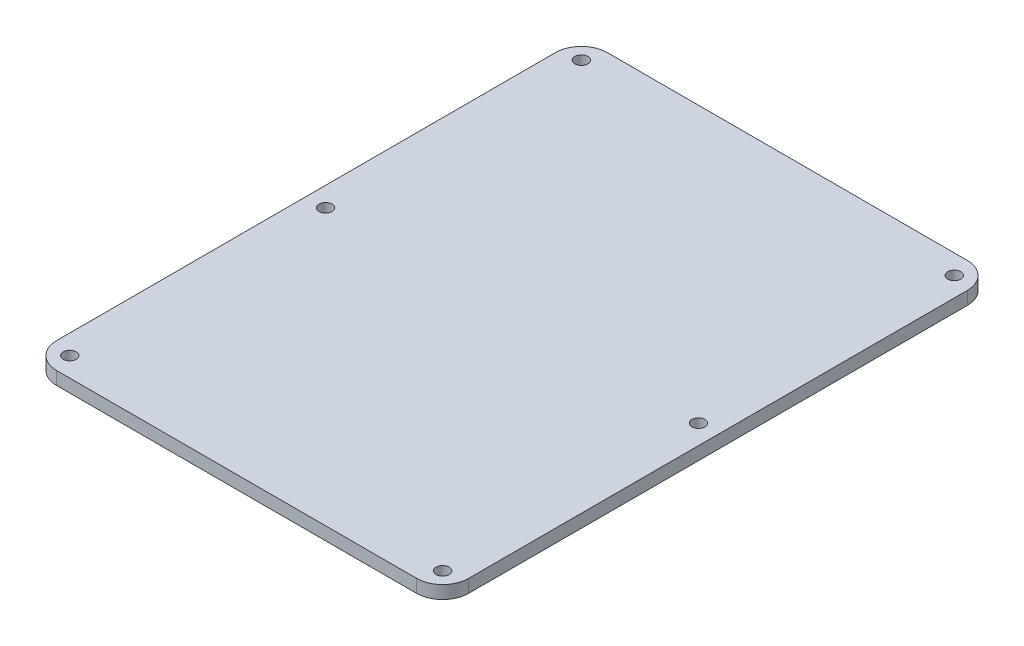
ISO-10303-21;
HEADER;
FILE_DESCRIPTION(('STEP AP214'),'2;1');
FILE_NAME('part.step','',(''),(''),'','','');
FILE_SCHEMA(('AUTOMOTIVE_DESIGN { 1 0 10303 214 1 1 1 1 }'));
ENDSEC;
DATA;
#1=APPLICATION_CONTEXT('core data for automotive mechanical design processes');
#2=APPLICATION_PROTOCOL_DEFINITION('international standard','automotive_design',2000,#1);
#3=PRODUCT_CONTEXT('',#1,'mechanical');
#4=PRODUCT('Part','Part','',(#3));
#5=PRODUCT_RELATED_PRODUCT_CATEGORY('part','',(#4));
#6=PRODUCT_DEFINITION_FORMATION('','',#4);
#7=PRODUCT_DEFINITION_CONTEXT('part definition',#1,'design');
#8=PRODUCT_DEFINITION('design','',#6,#7);
#9=PRODUCT_DEFINITION_SHAPE('','',#8);
#10=(LENGTH_UNIT() NAMED_UNIT(*) SI_UNIT(.MILLI.,.METRE.));
#11=(NAMED_UNIT(*) PLANE_ANGLE_UNIT() SI_UNIT($,.RADIAN.));
#12=(NAMED_UNIT(*) SI_UNIT($,.STERADIAN.) SOLID_ANGLE_UNIT());
#13=UNCERTAINTY_MEASURE_WITH_UNIT(LENGTH_MEASURE(1.E-05),#10,'distance_accuracy_value','');
#14=(GEOMETRIC_REPRESENTATION_CONTEXT(3) GLOBAL_UNCERTAINTY_ASSIGNED_CONTEXT((#13)) GLOBAL_UNIT_ASSIGNED_CONTEXT((#10,
#11,#12)) REPRESENTATION_CONTEXT('',''));
#15=CARTESIAN_POINT('',(0.,0.,0.));
#16=DIRECTION('',(0.,0.,1.));
#17=DIRECTION('',(1.,0.,0.));
#18=AXIS2_PLACEMENT_3D('',#15,#16,#17);
#19=CARTESIAN_POINT('',(47.5,3.,63.5));
#20=DIRECTION('',(-1.,0.,0.));
#21=DIRECTION('',(0.,0.,1.));
#22=AXIS2_PLACEMENT_3D('',#19,#20,#21);
#23=PLANE('',#22);
#24=DIRECTION('',(0.,0.,-1.));
#25=VECTOR('',#24,1.);
#26=CARTESIAN_POINT('',(47.5,0.,63.5));
#27=LINE('',#26,#25);
#28=CARTESIAN_POINT('',(47.5,0.,57.5));
#29=VERTEX_POINT('',#28);
#30=CARTESIAN_POINT('',(47.5,0.,-57.5));
#31=VERTEX_POINT('',#30);
#32=EDGE_CURVE('E126',#29,#31,#27,.T.);
#33=ORIENTED_EDGE('',*,*,#32,.T.);
#34=DIRECTION('',(0.,-1.,0.));
#35=VECTOR('',#34,1.);
#36=CARTESIAN_POINT('',(47.5,3.,-57.5));
#37=LINE('',#36,#35);
#38=CARTESIAN_POINT('',(47.5,3.,-57.5));
#39=VERTEX_POINT('',#38);
#40=EDGE_CURVE('E104',#31,#39,#37,.F.);
#41=ORIENTED_EDGE('',*,*,#40,.T.);
#42=DIRECTION('',(0.,0.,-1.));
#43=VECTOR('',#42,1.);
#44=CARTESIAN_POINT('',(47.5,3.,63.5));
#45=LINE('',#44,#43);
#46=CARTESIAN_POINT('',(47.5,3.,57.5));
#47=VERTEX_POINT('',#46);
#48=EDGE_CURVE('E136',#47,#39,#45,.T.);
#49=ORIENTED_EDGE('',*,*,#48,.F.);
#50=DIRECTION('',(0.,-1.,0.));
#51=VECTOR('',#50,1.);
#52=CARTESIAN_POINT('',(47.5,3.,57.5));
#53=LINE('',#52,#51);
#54=EDGE_CURVE('E109',#47,#29,#53,.T.);
#55=ORIENTED_EDGE('',*,*,#54,.T.);
#56=EDGE_LOOP('',(#33,#41,#49,#55));
#57=FACE_BOUND('',#56,.T.);
#58=ADVANCED_FACE('F33',(#57),#23,.F.);
#59=CARTESIAN_POINT('',(-47.5,3.,-63.5));
#60=DIRECTION('',(0.,0.,1.));
#61=DIRECTION('',(1.,0.,0.));
#62=AXIS2_PLACEMENT_3D('',#59,#60,#61);
#63=PLANE('',#62);
#64=DIRECTION('',(-1.,0.,0.));
#65=VECTOR('',#64,1.);
#66=CARTESIAN_POINT('',(-47.5,3.,-63.5));
#67=LINE('',#66,#65);
#68=CARTESIAN_POINT('',(41.5,3.,-63.5));
#69=VERTEX_POINT('',#68);
#70=CARTESIAN_POINT('',(-41.5,3.,-63.5));
#71=VERTEX_POINT('',#70);
#72=EDGE_CURVE('E119',#69,#71,#67,.T.);
#73=ORIENTED_EDGE('',*,*,#72,.F.);
#74=DIRECTION('',(0.,-1.,0.));
#75=VECTOR('',#74,1.);
#76=CARTESIAN_POINT('',(41.5,3.,-63.5));
#77=LINE('',#76,#75);
#78=CARTESIAN_POINT('',(41.5,0.,-63.5));
#79=VERTEX_POINT('',#78);
#80=EDGE_CURVE('E103',#69,#79,#77,.T.);
#81=ORIENTED_EDGE('',*,*,#80,.T.);
#82=DIRECTION('',(-1.,0.,0.));
#83=VECTOR('',#82,1.);
#84=CARTESIAN_POINT('',(-47.5,0.,-63.5));
#85=LINE('',#84,#83);
#86=CARTESIAN_POINT('',(-41.5,0.,-63.5));
#87=VERTEX_POINT('',#86);
#88=EDGE_CURVE('E116',#79,#87,#85,.T.);
#89=ORIENTED_EDGE('',*,*,#88,.T.);
#90=DIRECTION('',(0.,-1.,0.));
#91=VECTOR('',#90,1.);
#92=CARTESIAN_POINT('',(-41.5,3.,-63.5));
#93=LINE('',#92,#91);
#94=EDGE_CURVE('E121',#87,#71,#93,.F.);
#95=ORIENTED_EDGE('',*,*,#94,.T.);
#96=EDGE_LOOP('',(#73,#81,#89,#95));
#97=FACE_BOUND('',#96,.T.);
#98=ADVANCED_FACE('F115',(#97),#63,.F.);
#99=CARTESIAN_POINT('',(-47.5,3.,63.5));
#100=DIRECTION('',(1.,0.,0.));
#101=DIRECTION('',(0.,0.,-1.));
#102=AXIS2_PLACEMENT_3D('',#99,#100,#101);
#103=PLANE('',#102);
#104=DIRECTION('',(0.,0.,1.));
#105=VECTOR('',#104,1.);
#106=CARTESIAN_POINT('',(-47.5,3.,63.5));
#107=LINE('',#106,#105);
#108=CARTESIAN_POINT('',(-47.5,3.,-57.5));
#109=VERTEX_POINT('',#108);
#110=CARTESIAN_POINT('',(-47.5,3.,57.5));
#111=VERTEX_POINT('',#110);
#112=EDGE_CURVE('E162',#109,#111,#107,.T.);
#113=ORIENTED_EDGE('',*,*,#112,.F.);
#114=DIRECTION('',(0.,-1.,0.));
#115=VECTOR('',#114,1.);
#116=CARTESIAN_POINT('',(-47.5,3.,-57.5));
#117=LINE('',#116,#115);
#118=CARTESIAN_POINT('',(-47.5,0.,-57.5));
#119=VERTEX_POINT('',#118);
#120=EDGE_CURVE('E155',#109,#119,#117,.T.);
#121=ORIENTED_EDGE('',*,*,#120,.T.);
#122=DIRECTION('',(0.,0.,1.));
#123=VECTOR('',#122,1.);
#124=CARTESIAN_POINT('',(-47.5,0.,63.5));
#125=LINE('',#124,#123);
#126=CARTESIAN_POINT('',(-47.5,0.,57.5));
#127=VERTEX_POINT('',#126);
#128=EDGE_CURVE('E125',#119,#127,#125,.T.);
#129=ORIENTED_EDGE('',*,*,#128,.T.);
#130=DIRECTION('',(0.,-1.,0.));
#131=VECTOR('',#130,1.);
#132=CARTESIAN_POINT('',(-47.5,3.,57.5));
#133=LINE('',#132,#131);
#134=EDGE_CURVE('E153',#127,#111,#133,.F.);
#135=ORIENTED_EDGE('',*,*,#134,.T.);
#136=EDGE_LOOP('',(#113,#121,#129,#135));
#137=FACE_BOUND('',#136,.T.);
#138=ADVANCED_FACE('F160',(#137),#103,.F.);
#139=CARTESIAN_POINT('',(-47.5,3.,63.5));
#140=DIRECTION('',(0.,0.,-1.));
#141=DIRECTION('',(-1.,0.,0.));
#142=AXIS2_PLACEMENT_3D('',#139,#140,#141);
#143=PLANE('',#142);
#144=DIRECTION('',(1.,0.,0.));
#145=VECTOR('',#144,1.);
#146=CARTESIAN_POINT('',(-47.5,3.,63.5));
#147=LINE('',#146,#145);
#148=CARTESIAN_POINT('',(-41.5,3.,63.5));
#149=VERTEX_POINT('',#148);
#150=CARTESIAN_POINT('',(41.5,3.,63.5));
#151=VERTEX_POINT('',#150);
#152=EDGE_CURVE('E137',#149,#151,#147,.T.);
#153=ORIENTED_EDGE('',*,*,#152,.F.);
#154=DIRECTION('',(0.,-1.,0.));
#155=VECTOR('',#154,1.);
#156=CARTESIAN_POINT('',(-41.5,3.,63.5));
#157=LINE('',#156,#155);
#158=CARTESIAN_POINT('',(-41.5,0.,63.5));
#159=VERTEX_POINT('',#158);
#160=EDGE_CURVE('E11',#149,#159,#157,.T.);
#161=ORIENTED_EDGE('',*,*,#160,.T.);
#162=DIRECTION('',(1.,0.,0.));
#163=VECTOR('',#162,1.);
#164=CARTESIAN_POINT('',(-47.5,0.,63.5));
#165=LINE('',#164,#163);
#166=CARTESIAN_POINT('',(41.5,0.,63.5));
#167=VERTEX_POINT('',#166);
#168=EDGE_CURVE('E129',#159,#167,#165,.T.);
#169=ORIENTED_EDGE('',*,*,#168,.T.);
#170=DIRECTION('',(0.,-1.,0.));
#171=VECTOR('',#170,1.);
#172=CARTESIAN_POINT('',(41.5,3.,63.5));
#173=LINE('',#172,#171);
#174=EDGE_CURVE('E41',#167,#151,#173,.F.);
#175=ORIENTED_EDGE('',*,*,#174,.T.);
#176=EDGE_LOOP('',(#153,#161,#169,#175));
#177=FACE_BOUND('',#176,.T.);
#178=ADVANCED_FACE('F169',(#177),#143,.F.);
#179=CARTESIAN_POINT('',(0.,3.,0.));
#180=DIRECTION('',(0.,-1.,0.));
#181=DIRECTION('',(0.,0.,-1.));
#182=AXIS2_PLACEMENT_3D('',#179,#180,#181);
#183=PLANE('',#182);
#184=CARTESIAN_POINT('',(43.,3.,0.));
#185=DIRECTION('',(0.,-1.,0.));
#186=DIRECTION('',(0.,0.,1.));
#187=AXIS2_PLACEMENT_3D('',#184,#185,#186);
#188=CIRCLE('',#187,1.5);
#189=CARTESIAN_POINT('',(43.,3.,1.5));
#190=VERTEX_POINT('',#189);
#191=EDGE_CURVE('E206',#190,#190,#188,.T.);
#192=ORIENTED_EDGE('',*,*,#191,.T.);
#193=EDGE_LOOP('',(#192));
#194=FACE_BOUND('',#193,.T.);
#195=CARTESIAN_POINT('',(43.,3.,59.));
#196=DIRECTION('',(0.,1.,0.));
#197=DIRECTION('',(0.,0.,-1.));
#198=AXIS2_PLACEMENT_3D('',#195,#196,#197);
#199=CIRCLE('',#198,1.5);
#200=CARTESIAN_POINT('',(43.,3.,57.5));
#201=VERTEX_POINT('',#200);
#202=EDGE_CURVE('E200',#201,#201,#199,.T.);
#203=ORIENTED_EDGE('',*,*,#202,.F.);
#204=EDGE_LOOP('',(#203));
#205=FACE_BOUND('',#204,.T.);
#206=CARTESIAN_POINT('',(43.,3.,-59.));
#207=DIRECTION('',(0.,-1.,0.));
#208=DIRECTION('',(0.,0.,1.));
#209=AXIS2_PLACEMENT_3D('',#206,#207,#208);
#210=CIRCLE('',#209,1.5);
#211=CARTESIAN_POINT('',(43.,3.,-57.5));
#212=VERTEX_POINT('',#211);
#213=EDGE_CURVE('E194',#212,#212,#210,.T.);
#214=ORIENTED_EDGE('',*,*,#213,.T.);
#215=EDGE_LOOP('',(#214));
#216=FACE_BOUND('',#215,.T.);
#217=CARTESIAN_POINT('',(-43.,3.,0.));
#218=DIRECTION('',(0.,1.,0.));
#219=DIRECTION('',(0.,0.,1.));
#220=AXIS2_PLACEMENT_3D('',#217,#218,#219);
#221=CIRCLE('',#220,1.5);
#222=CARTESIAN_POINT('',(-43.,3.,1.5));
#223=VERTEX_POINT('',#222);
#224=EDGE_CURVE('E188',#223,#223,#221,.T.);
#225=ORIENTED_EDGE('',*,*,#224,.F.);
#226=EDGE_LOOP('',(#225));
#227=FACE_BOUND('',#226,.T.);
#228=CARTESIAN_POINT('',(-43.,3.,59.));
#229=DIRECTION('',(0.,-1.,0.));
#230=DIRECTION('',(0.,0.,-1.));
#231=AXIS2_PLACEMENT_3D('',#228,#229,#230);
#232=CIRCLE('',#231,1.5);
#233=CARTESIAN_POINT('',(-43.,3.,57.5));
#234=VERTEX_POINT('',#233);
#235=EDGE_CURVE('E182',#234,#234,#232,.T.);
#236=ORIENTED_EDGE('',*,*,#235,.T.);
#237=EDGE_LOOP('',(#236));
#238=FACE_BOUND('',#237,.T.);
#239=CARTESIAN_POINT('',(-43.,3.,-59.));
#240=DIRECTION('',(0.,1.,0.));
#241=DIRECTION('',(0.,0.,1.));
#242=AXIS2_PLACEMENT_3D('',#239,#240,#241);
#243=CIRCLE('',#242,1.5);
#244=CARTESIAN_POINT('',(-43.,3.,-57.5));
#245=VERTEX_POINT('',#244);
#246=EDGE_CURVE('E176',#245,#245,#243,.T.);
#247=ORIENTED_EDGE('',*,*,#246,.F.);
#248=EDGE_LOOP('',(#247));
#249=FACE_BOUND('',#248,.T.);
#250=ORIENTED_EDGE('',*,*,#48,.T.);
#251=CARTESIAN_POINT('',(41.5,3.,-57.5));
#252=DIRECTION('',(0.,-1.,0.));
#253=DIRECTION('',(0.,0.,-1.));
#254=AXIS2_PLACEMENT_3D('',#251,#252,#253);
#255=CIRCLE('',#254,6.);
#256=EDGE_CURVE('E151',#39,#69,#255,.F.);
#257=ORIENTED_EDGE('',*,*,#256,.T.);
#258=ORIENTED_EDGE('',*,*,#72,.T.);
#259=CARTESIAN_POINT('',(-41.5,3.,-57.5));
#260=DIRECTION('',(0.,-1.,0.));
#261=DIRECTION('',(0.,0.,-1.));
#262=AXIS2_PLACEMENT_3D('',#259,#260,#261);
#263=CIRCLE('',#262,6.);
#264=EDGE_CURVE('E149',#71,#109,#263,.F.);
#265=ORIENTED_EDGE('',*,*,#264,.T.);
#266=ORIENTED_EDGE('',*,*,#112,.T.);
#267=CARTESIAN_POINT('',(-41.5,3.,57.5));
#268=DIRECTION('',(0.,-1.,0.));
#269=DIRECTION('',(0.,0.,-1.));
#270=AXIS2_PLACEMENT_3D('',#267,#268,#269);
#271=CIRCLE('',#270,6.);
#272=EDGE_CURVE('E54',#111,#149,#271,.F.);
#273=ORIENTED_EDGE('',*,*,#272,.T.);
#274=ORIENTED_EDGE('',*,*,#152,.T.);
#275=CARTESIAN_POINT('',(41.5,3.,57.5));
#276=DIRECTION('',(0.,-1.,0.));
#277=DIRECTION('',(0.,0.,-1.));
#278=AXIS2_PLACEMENT_3D('',#275,#276,#277);
#279=CIRCLE('',#278,6.);
#280=EDGE_CURVE('E146',#151,#47,#279,.F.);
#281=ORIENTED_EDGE('',*,*,#280,.T.);
#282=EDGE_LOOP('',(#250,#257,#258,#265,#266,#273,#274,#281));
#283=FACE_BOUND('',#282,.T.);
#284=ADVANCED_FACE('F217',(#194,#205,#216,#227,#238,#249,#283),#183,.F.);
#285=CARTESIAN_POINT('',(0.,0.,0.));
#286=DIRECTION('',(0.,-1.,0.));
#287=DIRECTION('',(0.,0.,-1.));
#288=AXIS2_PLACEMENT_3D('',#285,#286,#287);
#289=PLANE('',#288);
#290=CARTESIAN_POINT('',(43.,0.,0.));
#291=DIRECTION('',(0.,-1.,0.));
#292=DIRECTION('',(0.,0.,1.));
#293=AXIS2_PLACEMENT_3D('',#290,#291,#292);
#294=CIRCLE('',#293,1.5);
#295=CARTESIAN_POINT('',(43.,0.,1.5));
#296=VERTEX_POINT('',#295);
#297=EDGE_CURVE('E203',#296,#296,#294,.T.);
#298=ORIENTED_EDGE('',*,*,#297,.F.);
#299=EDGE_LOOP('',(#298));
#300=FACE_BOUND('',#299,.T.);
#301=CARTESIAN_POINT('',(43.,0.,59.));
#302=DIRECTION('',(0.,1.,0.));
#303=DIRECTION('',(0.,0.,-1.));
#304=AXIS2_PLACEMENT_3D('',#301,#302,#303);
#305=CIRCLE('',#304,1.5);
#306=CARTESIAN_POINT('',(43.,0.,57.5));
#307=VERTEX_POINT('',#306);
#308=EDGE_CURVE('E197',#307,#307,#305,.T.);
#309=ORIENTED_EDGE('',*,*,#308,.T.);
#310=EDGE_LOOP('',(#309));
#311=FACE_BOUND('',#310,.T.);
#312=CARTESIAN_POINT('',(43.,0.,-59.));
#313=DIRECTION('',(0.,-1.,0.));
#314=DIRECTION('',(0.,0.,1.));
#315=AXIS2_PLACEMENT_3D('',#312,#313,#314);
#316=CIRCLE('',#315,1.5);
#317=CARTESIAN_POINT('',(43.,0.,-57.5));
#318=VERTEX_POINT('',#317);
#319=EDGE_CURVE('E191',#318,#318,#316,.T.);
#320=ORIENTED_EDGE('',*,*,#319,.F.);
#321=EDGE_LOOP('',(#320));
#322=FACE_BOUND('',#321,.T.);
#323=CARTESIAN_POINT('',(-43.,0.,0.));
#324=DIRECTION('',(0.,1.,0.));
#325=DIRECTION('',(0.,0.,1.));
#326=AXIS2_PLACEMENT_3D('',#323,#324,#325);
#327=CIRCLE('',#326,1.5);
#328=CARTESIAN_POINT('',(-43.,0.,1.5));
#329=VERTEX_POINT('',#328);
#330=EDGE_CURVE('E185',#329,#329,#327,.T.);
#331=ORIENTED_EDGE('',*,*,#330,.T.);
#332=EDGE_LOOP('',(#331));
#333=FACE_BOUND('',#332,.T.);
#334=CARTESIAN_POINT('',(-43.,0.,59.));
#335=DIRECTION('',(0.,-1.,0.));
#336=DIRECTION('',(0.,0.,-1.));
#337=AXIS2_PLACEMENT_3D('',#334,#335,#336);
#338=CIRCLE('',#337,1.5);
#339=CARTESIAN_POINT('',(-43.,0.,57.5));
#340=VERTEX_POINT('',#339);
#341=EDGE_CURVE('E179',#340,#340,#338,.T.);
#342=ORIENTED_EDGE('',*,*,#341,.F.);
#343=EDGE_LOOP('',(#342));
#344=FACE_BOUND('',#343,.T.);
#345=CARTESIAN_POINT('',(-43.,0.,-59.));
#346=DIRECTION('',(0.,1.,0.));
#347=DIRECTION('',(0.,0.,1.));
#348=AXIS2_PLACEMENT_3D('',#345,#346,#347);
#349=CIRCLE('',#348,1.5);
#350=CARTESIAN_POINT('',(-43.,0.,-57.5));
#351=VERTEX_POINT('',#350);
#352=EDGE_CURVE('E131',#351,#351,#349,.T.);
#353=ORIENTED_EDGE('',*,*,#352,.T.);
#354=EDGE_LOOP('',(#353));
#355=FACE_BOUND('',#354,.T.);
#356=ORIENTED_EDGE('',*,*,#88,.F.);
#357=CARTESIAN_POINT('',(41.5,0.,-57.5));
#358=DIRECTION('',(0.,-1.,0.));
#359=DIRECTION('',(0.,0.,-1.));
#360=AXIS2_PLACEMENT_3D('',#357,#358,#359);
#361=CIRCLE('',#360,6.);
#362=EDGE_CURVE('E99',#79,#31,#361,.T.);
#363=ORIENTED_EDGE('',*,*,#362,.T.);
#364=ORIENTED_EDGE('',*,*,#32,.F.);
#365=CARTESIAN_POINT('',(41.5,0.,57.5));
#366=DIRECTION('',(0.,-1.,0.));
#367=DIRECTION('',(0.,0.,-1.));
#368=AXIS2_PLACEMENT_3D('',#365,#366,#367);
#369=CIRCLE('',#368,6.);
#370=EDGE_CURVE('E120',#29,#167,#369,.T.);
#371=ORIENTED_EDGE('',*,*,#370,.T.);
#372=ORIENTED_EDGE('',*,*,#168,.F.);
#373=CARTESIAN_POINT('',(-41.5,0.,57.5));
#374=DIRECTION('',(0.,-1.,0.));
#375=DIRECTION('',(0.,0.,-1.));
#376=AXIS2_PLACEMENT_3D('',#373,#374,#375);
#377=CIRCLE('',#376,6.);
#378=EDGE_CURVE('E140',#159,#127,#377,.T.);
#379=ORIENTED_EDGE('',*,*,#378,.T.);
#380=ORIENTED_EDGE('',*,*,#128,.F.);
#381=CARTESIAN_POINT('',(-41.5,0.,-57.5));
#382=DIRECTION('',(0.,-1.,0.));
#383=DIRECTION('',(0.,0.,-1.));
#384=AXIS2_PLACEMENT_3D('',#381,#382,#383);
#385=CIRCLE('',#384,6.);
#386=EDGE_CURVE('E110',#119,#87,#385,.T.);
#387=ORIENTED_EDGE('',*,*,#386,.T.);
#388=EDGE_LOOP('',(#356,#363,#364,#371,#372,#379,#380,#387));
#389=FACE_BOUND('',#388,.T.);
#390=ADVANCED_FACE('F123',(#300,#311,#322,#333,#344,#355,#389),#289,.T.);
#391=CARTESIAN_POINT('',(41.5,3.,-57.5));
#392=DIRECTION('',(0.,-1.,0.));
#393=DIRECTION('',(0.,0.,-1.));
#394=AXIS2_PLACEMENT_3D('',#391,#392,#393);
#395=CYLINDRICAL_SURFACE('',#394,6.);
#396=ORIENTED_EDGE('',*,*,#256,.F.);
#397=ORIENTED_EDGE('',*,*,#40,.F.);
#398=ORIENTED_EDGE('',*,*,#362,.F.);
#399=ORIENTED_EDGE('',*,*,#80,.F.);
#400=EDGE_LOOP('',(#396,#397,#398,#399));
#401=FACE_BOUND('',#400,.T.);
#402=ADVANCED_FACE('F102',(#401),#395,.T.);
#403=CARTESIAN_POINT('',(-41.5,3.,-57.5));
#404=DIRECTION('',(0.,-1.,0.));
#405=DIRECTION('',(0.,0.,-1.));
#406=AXIS2_PLACEMENT_3D('',#403,#404,#405);
#407=CYLINDRICAL_SURFACE('',#406,6.);
#408=ORIENTED_EDGE('',*,*,#264,.F.);
#409=ORIENTED_EDGE('',*,*,#94,.F.);
#410=ORIENTED_EDGE('',*,*,#386,.F.);
#411=ORIENTED_EDGE('',*,*,#120,.F.);
#412=EDGE_LOOP('',(#408,#409,#410,#411));
#413=FACE_BOUND('',#412,.T.);
#414=ADVANCED_FACE('F247',(#413),#407,.T.);
#415=CARTESIAN_POINT('',(-41.5,3.,57.5));
#416=DIRECTION('',(0.,-1.,0.));
#417=DIRECTION('',(0.,0.,-1.));
#418=AXIS2_PLACEMENT_3D('',#415,#416,#417);
#419=CYLINDRICAL_SURFACE('',#418,6.);
#420=ORIENTED_EDGE('',*,*,#272,.F.);
#421=ORIENTED_EDGE('',*,*,#134,.F.);
#422=ORIENTED_EDGE('',*,*,#378,.F.);
#423=ORIENTED_EDGE('',*,*,#160,.F.);
#424=EDGE_LOOP('',(#420,#421,#422,#423));
#425=FACE_BOUND('',#424,.T.);
#426=ADVANCED_FACE('F168',(#425),#419,.T.);
#427=CARTESIAN_POINT('',(41.5,3.,57.5));
#428=DIRECTION('',(0.,-1.,0.));
#429=DIRECTION('',(0.,0.,-1.));
#430=AXIS2_PLACEMENT_3D('',#427,#428,#429);
#431=CYLINDRICAL_SURFACE('',#430,6.);
#432=ORIENTED_EDGE('',*,*,#280,.F.);
#433=ORIENTED_EDGE('',*,*,#174,.F.);
#434=ORIENTED_EDGE('',*,*,#370,.F.);
#435=ORIENTED_EDGE('',*,*,#54,.F.);
#436=EDGE_LOOP('',(#432,#433,#434,#435));
#437=FACE_BOUND('',#436,.T.);
#438=ADVANCED_FACE('F35',(#437),#431,.T.);
#439=CARTESIAN_POINT('',(-43.,0.,-59.));
#440=DIRECTION('',(0.,1.,0.));
#441=DIRECTION('',(0.,0.,1.));
#442=AXIS2_PLACEMENT_3D('',#439,#440,#441);
#443=CYLINDRICAL_SURFACE('',#442,1.5);
#444=ORIENTED_EDGE('',*,*,#352,.F.);
#445=EDGE_LOOP('',(#444));
#446=FACE_BOUND('',#445,.T.);
#447=ORIENTED_EDGE('',*,*,#246,.T.);
#448=EDGE_LOOP('',(#447));
#449=FACE_BOUND('',#448,.T.);
#450=ADVANCED_FACE('F229',(#446,#449),#443,.F.);
#451=CARTESIAN_POINT('',(-43.,0.,59.));
#452=DIRECTION('',(0.,1.,0.));
#453=DIRECTION('',(0.,0.,1.));
#454=AXIS2_PLACEMENT_3D('',#451,#452,#453);
#455=CYLINDRICAL_SURFACE('',#454,1.5);
#456=ORIENTED_EDGE('',*,*,#341,.T.);
#457=EDGE_LOOP('',(#456));
#458=FACE_BOUND('',#457,.T.);
#459=ORIENTED_EDGE('',*,*,#235,.F.);
#460=EDGE_LOOP('',(#459));
#461=FACE_BOUND('',#460,.T.);
#462=ADVANCED_FACE('F232',(#458,#461),#455,.F.);
#463=CARTESIAN_POINT('',(-43.,0.,0.));
#464=DIRECTION('',(0.,1.,0.));
#465=DIRECTION('',(0.,0.,1.));
#466=AXIS2_PLACEMENT_3D('',#463,#464,#465);
#467=CYLINDRICAL_SURFACE('',#466,1.5);
#468=ORIENTED_EDGE('',*,*,#330,.F.);
#469=EDGE_LOOP('',(#468));
#470=FACE_BOUND('',#469,.T.);
#471=ORIENTED_EDGE('',*,*,#224,.T.);
#472=EDGE_LOOP('',(#471));
#473=FACE_BOUND('',#472,.T.);
#474=ADVANCED_FACE('F286',(#470,#473),#467,.F.);
#475=CARTESIAN_POINT('',(43.,0.,-59.));
#476=DIRECTION('',(0.,1.,0.));
#477=DIRECTION('',(0.,0.,1.));
#478=AXIS2_PLACEMENT_3D('',#475,#476,#477);
#479=CYLINDRICAL_SURFACE('',#478,1.5);
#480=ORIENTED_EDGE('',*,*,#319,.T.);
#481=EDGE_LOOP('',(#480));
#482=FACE_BOUND('',#481,.T.);
#483=ORIENTED_EDGE('',*,*,#213,.F.);
#484=EDGE_LOOP('',(#483));
#485=FACE_BOUND('',#484,.T.);
#486=ADVANCED_FACE('F296',(#482,#485),#479,.F.);
#487=CARTESIAN_POINT('',(43.,0.,59.));
#488=DIRECTION('',(0.,1.,0.));
#489=DIRECTION('',(0.,0.,1.));
#490=AXIS2_PLACEMENT_3D('',#487,#488,#489);
#491=CYLINDRICAL_SURFACE('',#490,1.5);
#492=ORIENTED_EDGE('',*,*,#308,.F.);
#493=EDGE_LOOP('',(#492));
#494=FACE_BOUND('',#493,.T.);
#495=ORIENTED_EDGE('',*,*,#202,.T.);
#496=EDGE_LOOP('',(#495));
#497=FACE_BOUND('',#496,.T.);
#498=ADVANCED_FACE('F321',(#494,#497),#491,.F.);
#499=CARTESIAN_POINT('',(43.,0.,0.));
#500=DIRECTION('',(0.,1.,0.));
#501=DIRECTION('',(0.,0.,1.));
#502=AXIS2_PLACEMENT_3D('',#499,#500,#501);
#503=CYLINDRICAL_SURFACE('',#502,1.5);
#504=ORIENTED_EDGE('',*,*,#297,.T.);
#505=EDGE_LOOP('',(#504));
#506=FACE_BOUND('',#505,.T.);
#507=ORIENTED_EDGE('',*,*,#191,.F.);
#508=EDGE_LOOP('',(#507));
#509=FACE_BOUND('',#508,.T.);
#510=ADVANCED_FACE('F212',(#506,#509),#503,.F.);
#511=CLOSED_SHELL('',(#58,#98,#138,#178,#284,#390,#402,#414,#426,#438,#450,#462,#474,#486,#498,#510));
#512=MANIFOLD_SOLID_BREP('B2',#511);
#513=ADVANCED_BREP_SHAPE_REPRESENTATION('',(#18,#512),#14);
#514=SHAPE_DEFINITION_REPRESENTATION(#9,#513);
ENDSEC;
END-ISO-10303-21;
